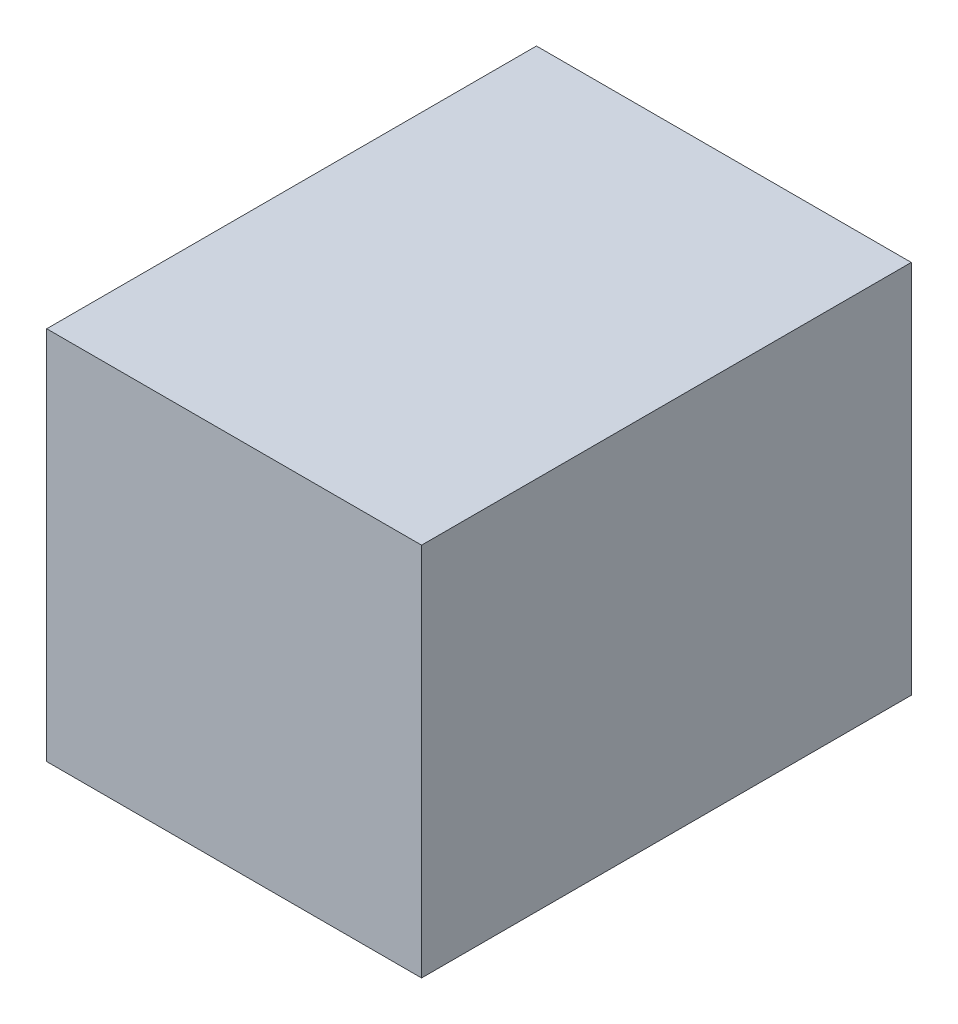
ISO-10303-21;
HEADER;
FILE_DESCRIPTION(('STEP AP214'),'2;1');
FILE_NAME('part.step','',(''),(''),'','','');
FILE_SCHEMA(('AUTOMOTIVE_DESIGN { 1 0 10303 214 1 1 1 1 }'));
ENDSEC;
DATA;
#1=APPLICATION_CONTEXT('core data for automotive mechanical design processes');
#2=APPLICATION_PROTOCOL_DEFINITION('international standard','automotive_design',2000,#1);
#3=PRODUCT_CONTEXT('',#1,'mechanical');
#4=PRODUCT('Part','Part','',(#3));
#5=PRODUCT_RELATED_PRODUCT_CATEGORY('part','',(#4));
#6=PRODUCT_DEFINITION_FORMATION('','',#4);
#7=PRODUCT_DEFINITION_CONTEXT('part definition',#1,'design');
#8=PRODUCT_DEFINITION('design','',#6,#7);
#9=PRODUCT_DEFINITION_SHAPE('','',#8);
#10=(LENGTH_UNIT() NAMED_UNIT(*) SI_UNIT(.MILLI.,.METRE.));
#11=(NAMED_UNIT(*) PLANE_ANGLE_UNIT() SI_UNIT($,.RADIAN.));
#12=(NAMED_UNIT(*) SI_UNIT($,.STERADIAN.) SOLID_ANGLE_UNIT());
#13=UNCERTAINTY_MEASURE_WITH_UNIT(LENGTH_MEASURE(1.E-05),#10,'distance_accuracy_value','');
#14=(GEOMETRIC_REPRESENTATION_CONTEXT(3) GLOBAL_UNCERTAINTY_ASSIGNED_CONTEXT((#13)) GLOBAL_UNIT_ASSIGNED_CONTEXT((#10,
#11,#12)) REPRESENTATION_CONTEXT('',''));
#15=CARTESIAN_POINT('',(0.,0.,0.));
#16=DIRECTION('',(0.,0.,1.));
#17=DIRECTION('',(1.,0.,0.));
#18=AXIS2_PLACEMENT_3D('',#15,#16,#17);
#19=CARTESIAN_POINT('',(-0.03470964317927,0.120570176931,0.674985954115));
#20=DIRECTION('',(-1.,0.,0.));
#21=DIRECTION('',(0.,0.,1.));
#22=AXIS2_PLACEMENT_3D('',#19,#20,#21);
#23=PLANE('',#22);
#24=DIRECTION('',(0.,0.,1.));
#25=VECTOR('',#24,1.);
#26=CARTESIAN_POINT('',(-0.03470964317927,0.197113386808,0.674985954115));
#27=LINE('',#26,#25);
#28=CARTESIAN_POINT('',(-0.03470964317927,0.197113386808,0.674985954115));
#29=VERTEX_POINT('',#28);
#30=CARTESIAN_POINT('',(-0.03470964317927,0.197113386808,0.774985954115));
#31=VERTEX_POINT('',#30);
#32=EDGE_CURVE('E19',#29,#31,#27,.T.);
#33=ORIENTED_EDGE('',*,*,#32,.F.);
#34=DIRECTION('',(0.,1.,0.));
#35=VECTOR('',#34,1.);
#36=CARTESIAN_POINT('',(-0.03470964317927,0.120570176931,0.674985954115));
#37=LINE('',#36,#35);
#38=CARTESIAN_POINT('',(-0.03470964317927,0.120570176931,0.674985954115));
#39=VERTEX_POINT('',#38);
#40=EDGE_CURVE('E78',#39,#29,#37,.T.);
#41=ORIENTED_EDGE('',*,*,#40,.F.);
#42=DIRECTION('',(0.,0.,-1.));
#43=VECTOR('',#42,1.);
#44=CARTESIAN_POINT('',(-0.03470964317927,0.120570176931,0.674985954115));
#45=LINE('',#44,#43);
#46=CARTESIAN_POINT('',(-0.03470964317927,0.120570176931,0.774985954115));
#47=VERTEX_POINT('',#46);
#48=EDGE_CURVE('E67',#47,#39,#45,.T.);
#49=ORIENTED_EDGE('',*,*,#48,.F.);
#50=DIRECTION('',(0.,1.,0.));
#51=VECTOR('',#50,1.);
#52=CARTESIAN_POINT('',(-0.03470964317927,0.120570176931,0.774985954115));
#53=LINE('',#52,#51);
#54=EDGE_CURVE('E55',#31,#47,#53,.F.);
#55=ORIENTED_EDGE('',*,*,#54,.F.);
#56=EDGE_LOOP('',(#33,#41,#49,#55));
#57=FACE_BOUND('',#56,.T.);
#58=ADVANCED_FACE('F16',(#57),#23,.T.);
#59=CARTESIAN_POINT('',(-0.03470964317927,0.197113386808,0.674985954115));
#60=DIRECTION('',(0.,1.,0.));
#61=DIRECTION('',(0.,0.,1.));
#62=AXIS2_PLACEMENT_3D('',#59,#60,#61);
#63=PLANE('',#62);
#64=DIRECTION('',(0.,0.,-1.));
#65=VECTOR('',#64,1.);
#66=CARTESIAN_POINT('',(0.04183356669727,0.197113386808,0.674985954115));
#67=LINE('',#66,#65);
#68=CARTESIAN_POINT('',(0.04183356669727,0.197113386808,0.674985954115));
#69=VERTEX_POINT('',#68);
#70=CARTESIAN_POINT('',(0.04183356669727,0.197113386808,0.774985954115));
#71=VERTEX_POINT('',#70);
#72=EDGE_CURVE('E82',#69,#71,#67,.F.);
#73=ORIENTED_EDGE('',*,*,#72,.F.);
#74=DIRECTION('',(-1.,0.,0.));
#75=VECTOR('',#74,1.);
#76=CARTESIAN_POINT('',(-0.03470964317927,0.197113386808,0.674985954115));
#77=LINE('',#76,#75);
#78=EDGE_CURVE('E64',#29,#69,#77,.F.);
#79=ORIENTED_EDGE('',*,*,#78,.F.);
#80=ORIENTED_EDGE('',*,*,#32,.T.);
#81=DIRECTION('',(1.,0.,0.));
#82=VECTOR('',#81,1.);
#83=CARTESIAN_POINT('',(-0.03470964317927,0.197113386808,0.774985954115));
#84=LINE('',#83,#82);
#85=EDGE_CURVE('E61',#71,#31,#84,.F.);
#86=ORIENTED_EDGE('',*,*,#85,.F.);
#87=EDGE_LOOP('',(#73,#79,#80,#86));
#88=FACE_BOUND('',#87,.T.);
#89=ADVANCED_FACE('F60',(#88),#63,.T.);
#90=CARTESIAN_POINT('',(-0.03470964317927,0.120570176931,0.774985954115));
#91=DIRECTION('',(0.,0.,1.));
#92=DIRECTION('',(1.,0.,0.));
#93=AXIS2_PLACEMENT_3D('',#90,#91,#92);
#94=PLANE('',#93);
#95=ORIENTED_EDGE('',*,*,#85,.T.);
#96=ORIENTED_EDGE('',*,*,#54,.T.);
#97=DIRECTION('',(1.,0.,0.));
#98=VECTOR('',#97,1.);
#99=CARTESIAN_POINT('',(0.04183356669727,0.120570176931,0.774985954115));
#100=LINE('',#99,#98);
#101=CARTESIAN_POINT('',(0.04183356669727,0.120570176931,0.774985954115));
#102=VERTEX_POINT('',#101);
#103=EDGE_CURVE('E69',#102,#47,#100,.F.);
#104=ORIENTED_EDGE('',*,*,#103,.F.);
#105=DIRECTION('',(0.,1.,0.));
#106=VECTOR('',#105,1.);
#107=CARTESIAN_POINT('',(0.04183356669727,0.197113386808,0.774985954115));
#108=LINE('',#107,#106);
#109=EDGE_CURVE('E73',#71,#102,#108,.F.);
#110=ORIENTED_EDGE('',*,*,#109,.F.);
#111=EDGE_LOOP('',(#95,#96,#104,#110));
#112=FACE_BOUND('',#111,.T.);
#113=ADVANCED_FACE('F71',(#112),#94,.T.);
#114=CARTESIAN_POINT('',(0.04183356669727,0.120570176931,0.674985954115));
#115=DIRECTION('',(0.,-1.,0.));
#116=DIRECTION('',(0.,0.,-1.));
#117=AXIS2_PLACEMENT_3D('',#114,#115,#116);
#118=PLANE('',#117);
#119=ORIENTED_EDGE('',*,*,#48,.T.);
#120=DIRECTION('',(-1.,0.,0.));
#121=VECTOR('',#120,1.);
#122=CARTESIAN_POINT('',(-0.03470964317927,0.120570176931,0.674985954115));
#123=LINE('',#122,#121);
#124=CARTESIAN_POINT('',(0.04183356669727,0.120570176931,0.674985954115));
#125=VERTEX_POINT('',#124);
#126=EDGE_CURVE('E34',#125,#39,#123,.T.);
#127=ORIENTED_EDGE('',*,*,#126,.F.);
#128=DIRECTION('',(0.,0.,-1.));
#129=VECTOR('',#128,1.);
#130=CARTESIAN_POINT('',(0.04183356669727,0.120570176931,0.674985954115));
#131=LINE('',#130,#129);
#132=EDGE_CURVE('E25',#102,#125,#131,.T.);
#133=ORIENTED_EDGE('',*,*,#132,.F.);
#134=ORIENTED_EDGE('',*,*,#103,.T.);
#135=EDGE_LOOP('',(#119,#127,#133,#134));
#136=FACE_BOUND('',#135,.T.);
#137=ADVANCED_FACE('F88',(#136),#118,.T.);
#138=CARTESIAN_POINT('',(-0.03470964317927,0.120570176931,0.674985954115));
#139=DIRECTION('',(0.,0.,-1.));
#140=DIRECTION('',(-1.,0.,0.));
#141=AXIS2_PLACEMENT_3D('',#138,#139,#140);
#142=PLANE('',#141);
#143=DIRECTION('',(0.,1.,0.));
#144=VECTOR('',#143,1.);
#145=CARTESIAN_POINT('',(0.04183356669727,0.197113386808,0.674985954115));
#146=LINE('',#145,#144);
#147=EDGE_CURVE('E11',#125,#69,#146,.T.);
#148=ORIENTED_EDGE('',*,*,#147,.F.);
#149=ORIENTED_EDGE('',*,*,#126,.T.);
#150=ORIENTED_EDGE('',*,*,#40,.T.);
#151=ORIENTED_EDGE('',*,*,#78,.T.);
#152=EDGE_LOOP('',(#148,#149,#150,#151));
#153=FACE_BOUND('',#152,.T.);
#154=ADVANCED_FACE('F90',(#153),#142,.T.);
#155=CARTESIAN_POINT('',(0.04183356669727,0.197113386808,0.674985954115));
#156=DIRECTION('',(1.,0.,0.));
#157=DIRECTION('',(0.,0.,-1.));
#158=AXIS2_PLACEMENT_3D('',#155,#156,#157);
#159=PLANE('',#158);
#160=ORIENTED_EDGE('',*,*,#132,.T.);
#161=ORIENTED_EDGE('',*,*,#147,.T.);
#162=ORIENTED_EDGE('',*,*,#72,.T.);
#163=ORIENTED_EDGE('',*,*,#109,.T.);
#164=EDGE_LOOP('',(#160,#161,#162,#163));
#165=FACE_BOUND('',#164,.T.);
#166=ADVANCED_FACE('F87',(#165),#159,.T.);
#167=CLOSED_SHELL('',(#58,#89,#113,#137,#154,#166));
#168=MANIFOLD_SOLID_BREP('B1',#167);
#169=ADVANCED_BREP_SHAPE_REPRESENTATION('',(#18,#168),#14);
#170=SHAPE_DEFINITION_REPRESENTATION(#9,#169);
ENDSEC;
END-ISO-10303-21;
